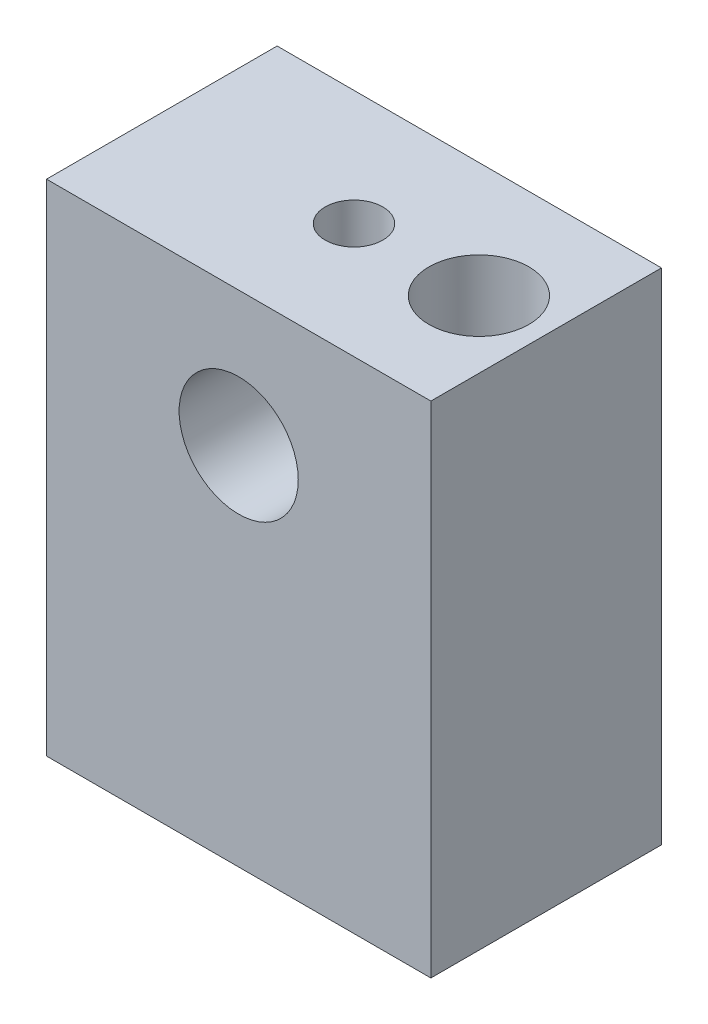
ISO-10303-21;
HEADER;
FILE_DESCRIPTION(('STEP AP214'),'2;1');
FILE_NAME('part.step','',(''),(''),'','','');
FILE_SCHEMA(('AUTOMOTIVE_DESIGN { 1 0 10303 214 1 1 1 1 }'));
ENDSEC;
DATA;
#1=APPLICATION_CONTEXT('core data for automotive mechanical design processes');
#2=APPLICATION_PROTOCOL_DEFINITION('international standard','automotive_design',2000,#1);
#3=PRODUCT_CONTEXT('',#1,'mechanical');
#4=PRODUCT('Part','Part','',(#3));
#5=PRODUCT_RELATED_PRODUCT_CATEGORY('part','',(#4));
#6=PRODUCT_DEFINITION_FORMATION('','',#4);
#7=PRODUCT_DEFINITION_CONTEXT('part definition',#1,'design');
#8=PRODUCT_DEFINITION('design','',#6,#7);
#9=PRODUCT_DEFINITION_SHAPE('','',#8);
#10=(LENGTH_UNIT() NAMED_UNIT(*) SI_UNIT(.MILLI.,.METRE.));
#11=(NAMED_UNIT(*) PLANE_ANGLE_UNIT() SI_UNIT($,.RADIAN.));
#12=(NAMED_UNIT(*) SI_UNIT($,.STERADIAN.) SOLID_ANGLE_UNIT());
#13=UNCERTAINTY_MEASURE_WITH_UNIT(LENGTH_MEASURE(1.E-05),#10,'distance_accuracy_value','');
#14=(GEOMETRIC_REPRESENTATION_CONTEXT(3) GLOBAL_UNCERTAINTY_ASSIGNED_CONTEXT((#13)) GLOBAL_UNIT_ASSIGNED_CONTEXT((#10,
#11,#12)) REPRESENTATION_CONTEXT('',''));
#15=CARTESIAN_POINT('',(0.,0.,0.));
#16=DIRECTION('',(0.,0.,1.));
#17=DIRECTION('',(1.,0.,0.));
#18=AXIS2_PLACEMENT_3D('',#15,#16,#17);
#19=CARTESIAN_POINT('',(-9.99999999999999,26.,12.));
#20=DIRECTION('',(1.,0.,0.));
#21=DIRECTION('',(0.,0.,-1.));
#22=AXIS2_PLACEMENT_3D('',#19,#20,#21);
#23=PLANE('',#22);
#24=DIRECTION('',(0.,-1.,0.));
#25=VECTOR('',#24,1.);
#26=CARTESIAN_POINT('',(-9.99999999999999,26.,0.));
#27=LINE('',#26,#25);
#28=CARTESIAN_POINT('',(-9.99999999999999,26.,0.));
#29=VERTEX_POINT('',#28);
#30=CARTESIAN_POINT('',(-9.99999999999999,0.,0.));
#31=VERTEX_POINT('',#30);
#32=EDGE_CURVE('E104',#29,#31,#27,.T.);
#33=ORIENTED_EDGE('',*,*,#32,.T.);
#34=DIRECTION('',(0.,0.,-1.));
#35=VECTOR('',#34,1.);
#36=CARTESIAN_POINT('',(-9.99999999999999,0.,12.));
#37=LINE('',#36,#35);
#38=CARTESIAN_POINT('',(-9.99999999999999,0.,12.));
#39=VERTEX_POINT('',#38);
#40=EDGE_CURVE('E11',#39,#31,#37,.T.);
#41=ORIENTED_EDGE('',*,*,#40,.F.);
#42=DIRECTION('',(0.,-1.,0.));
#43=VECTOR('',#42,1.);
#44=CARTESIAN_POINT('',(-9.99999999999999,26.,12.));
#45=LINE('',#44,#43);
#46=CARTESIAN_POINT('',(-9.99999999999999,26.,12.));
#47=VERTEX_POINT('',#46);
#48=EDGE_CURVE('E95',#47,#39,#45,.T.);
#49=ORIENTED_EDGE('',*,*,#48,.F.);
#50=DIRECTION('',(0.,0.,-1.));
#51=VECTOR('',#50,1.);
#52=CARTESIAN_POINT('',(-9.99999999999999,26.,12.));
#53=LINE('',#52,#51);
#54=EDGE_CURVE('E101',#47,#29,#53,.T.);
#55=ORIENTED_EDGE('',*,*,#54,.T.);
#56=EDGE_LOOP('',(#33,#41,#49,#55));
#57=FACE_BOUND('',#56,.T.);
#58=ADVANCED_FACE('F39',(#57),#23,.F.);
#59=CARTESIAN_POINT('',(-9.99999999999999,0.,12.));
#60=DIRECTION('',(0.,1.,0.));
#61=DIRECTION('',(0.,0.,1.));
#62=AXIS2_PLACEMENT_3D('',#59,#60,#61);
#63=PLANE('',#62);
#64=CARTESIAN_POINT('',(6.50000000000001,0.,6.00000000000001));
#65=DIRECTION('',(0.,1.,0.));
#66=DIRECTION('',(0.,0.,1.));
#67=AXIS2_PLACEMENT_3D('',#64,#65,#66);
#68=CIRCLE('',#67,2.6);
#69=CARTESIAN_POINT('',(6.50000000000001,0.,8.60000000000001));
#70=VERTEX_POINT('',#69);
#71=EDGE_CURVE('E119',#70,#70,#68,.T.);
#72=ORIENTED_EDGE('',*,*,#71,.T.);
#73=EDGE_LOOP('',(#72));
#74=FACE_BOUND('',#73,.T.);
#75=CARTESIAN_POINT('',(0.,0.,6.00000000000001));
#76=DIRECTION('',(0.,1.,0.));
#77=DIRECTION('',(0.,0.,1.));
#78=AXIS2_PLACEMENT_3D('',#75,#76,#77);
#79=CIRCLE('',#78,1.5);
#80=CARTESIAN_POINT('',(0.,0.,7.50000000000001));
#81=VERTEX_POINT('',#80);
#82=EDGE_CURVE('E209',#81,#81,#79,.T.);
#83=ORIENTED_EDGE('',*,*,#82,.T.);
#84=EDGE_LOOP('',(#83));
#85=FACE_BOUND('',#84,.T.);
#86=DIRECTION('',(1.,0.,0.));
#87=VECTOR('',#86,1.);
#88=CARTESIAN_POINT('',(-9.99999999999999,0.,0.));
#89=LINE('',#88,#87);
#90=CARTESIAN_POINT('',(9.99999999999999,0.,0.));
#91=VERTEX_POINT('',#90);
#92=EDGE_CURVE('E96',#31,#91,#89,.T.);
#93=ORIENTED_EDGE('',*,*,#92,.T.);
#94=DIRECTION('',(0.,0.,-1.));
#95=VECTOR('',#94,1.);
#96=CARTESIAN_POINT('',(9.99999999999999,0.,12.));
#97=LINE('',#96,#95);
#98=CARTESIAN_POINT('',(9.99999999999999,0.,12.));
#99=VERTEX_POINT('',#98);
#100=EDGE_CURVE('E48',#99,#91,#97,.T.);
#101=ORIENTED_EDGE('',*,*,#100,.F.);
#102=DIRECTION('',(1.,0.,0.));
#103=VECTOR('',#102,1.);
#104=CARTESIAN_POINT('',(-9.99999999999999,0.,12.));
#105=LINE('',#104,#103);
#106=EDGE_CURVE('E87',#39,#99,#105,.T.);
#107=ORIENTED_EDGE('',*,*,#106,.F.);
#108=ORIENTED_EDGE('',*,*,#40,.T.);
#109=EDGE_LOOP('',(#93,#101,#107,#108));
#110=FACE_BOUND('',#109,.T.);
#111=ADVANCED_FACE('F92',(#74,#85,#110),#63,.F.);
#112=CARTESIAN_POINT('',(9.99999999999999,0.,12.));
#113=DIRECTION('',(-1.,0.,0.));
#114=DIRECTION('',(0.,0.,1.));
#115=AXIS2_PLACEMENT_3D('',#112,#113,#114);
#116=PLANE('',#115);
#117=DIRECTION('',(0.,1.,0.));
#118=VECTOR('',#117,1.);
#119=CARTESIAN_POINT('',(9.99999999999999,0.,0.));
#120=LINE('',#119,#118);
#121=CARTESIAN_POINT('',(9.99999999999999,26.,0.));
#122=VERTEX_POINT('',#121);
#123=EDGE_CURVE('E74',#91,#122,#120,.T.);
#124=ORIENTED_EDGE('',*,*,#123,.T.);
#125=DIRECTION('',(0.,0.,-1.));
#126=VECTOR('',#125,1.);
#127=CARTESIAN_POINT('',(9.99999999999999,26.,12.));
#128=LINE('',#127,#126);
#129=CARTESIAN_POINT('',(9.99999999999999,26.,12.));
#130=VERTEX_POINT('',#129);
#131=EDGE_CURVE('E100',#130,#122,#128,.T.);
#132=ORIENTED_EDGE('',*,*,#131,.F.);
#133=DIRECTION('',(0.,1.,0.));
#134=VECTOR('',#133,1.);
#135=CARTESIAN_POINT('',(9.99999999999999,0.,12.));
#136=LINE('',#135,#134);
#137=EDGE_CURVE('E89',#99,#130,#136,.T.);
#138=ORIENTED_EDGE('',*,*,#137,.F.);
#139=ORIENTED_EDGE('',*,*,#100,.T.);
#140=EDGE_LOOP('',(#124,#132,#138,#139));
#141=FACE_BOUND('',#140,.T.);
#142=ADVANCED_FACE('F97',(#141),#116,.F.);
#143=CARTESIAN_POINT('',(9.99999999999999,26.,12.));
#144=DIRECTION('',(0.,-1.,0.));
#145=DIRECTION('',(0.,0.,-1.));
#146=AXIS2_PLACEMENT_3D('',#143,#144,#145);
#147=PLANE('',#146);
#148=CARTESIAN_POINT('',(6.50000000000001,26.,6.00000000000001));
#149=DIRECTION('',(0.,-1.,0.));
#150=DIRECTION('',(0.,0.,-1.));
#151=AXIS2_PLACEMENT_3D('',#148,#149,#150);
#152=CIRCLE('',#151,2.6);
#153=CARTESIAN_POINT('',(6.50000000000001,26.,3.4));
#154=VERTEX_POINT('',#153);
#155=EDGE_CURVE('E45',#154,#154,#152,.T.);
#156=ORIENTED_EDGE('',*,*,#155,.T.);
#157=EDGE_LOOP('',(#156));
#158=FACE_BOUND('',#157,.T.);
#159=CARTESIAN_POINT('',(0.,26.,6.00000000000001));
#160=DIRECTION('',(0.,-1.,0.));
#161=DIRECTION('',(0.,0.,-1.));
#162=AXIS2_PLACEMENT_3D('',#159,#160,#161);
#163=CIRCLE('',#162,1.5);
#164=CARTESIAN_POINT('',(0.,26.,4.5));
#165=VERTEX_POINT('',#164);
#166=EDGE_CURVE('E208',#165,#165,#163,.T.);
#167=ORIENTED_EDGE('',*,*,#166,.T.);
#168=EDGE_LOOP('',(#167));
#169=FACE_BOUND('',#168,.T.);
#170=DIRECTION('',(-1.,0.,0.));
#171=VECTOR('',#170,1.);
#172=CARTESIAN_POINT('',(9.99999999999999,26.,0.));
#173=LINE('',#172,#171);
#174=EDGE_CURVE('E78',#122,#29,#173,.T.);
#175=ORIENTED_EDGE('',*,*,#174,.T.);
#176=ORIENTED_EDGE('',*,*,#54,.F.);
#177=DIRECTION('',(-1.,0.,0.));
#178=VECTOR('',#177,1.);
#179=CARTESIAN_POINT('',(9.99999999999999,26.,12.));
#180=LINE('',#179,#178);
#181=EDGE_CURVE('E60',#130,#47,#180,.T.);
#182=ORIENTED_EDGE('',*,*,#181,.F.);
#183=ORIENTED_EDGE('',*,*,#131,.T.);
#184=EDGE_LOOP('',(#175,#176,#182,#183));
#185=FACE_BOUND('',#184,.T.);
#186=ADVANCED_FACE('F167',(#158,#169,#185),#147,.F.);
#187=CARTESIAN_POINT('',(0.,0.,12.));
#188=DIRECTION('',(0.,0.,1.));
#189=DIRECTION('',(1.,0.,0.));
#190=AXIS2_PLACEMENT_3D('',#187,#188,#189);
#191=PLANE('',#190);
#192=CARTESIAN_POINT('',(0.,19.,12.));
#193=DIRECTION('',(0.,0.,1.));
#194=DIRECTION('',(1.,0.,0.));
#195=AXIS2_PLACEMENT_3D('',#192,#193,#194);
#196=CIRCLE('',#195,3.1);
#197=CARTESIAN_POINT('',(3.1,19.,12.));
#198=VERTEX_POINT('',#197);
#199=EDGE_CURVE('E107',#198,#198,#196,.T.);
#200=ORIENTED_EDGE('',*,*,#199,.F.);
#201=EDGE_LOOP('',(#200));
#202=FACE_BOUND('',#201,.T.);
#203=ORIENTED_EDGE('',*,*,#48,.T.);
#204=ORIENTED_EDGE('',*,*,#106,.T.);
#205=ORIENTED_EDGE('',*,*,#137,.T.);
#206=ORIENTED_EDGE('',*,*,#181,.T.);
#207=EDGE_LOOP('',(#203,#204,#205,#206));
#208=FACE_BOUND('',#207,.T.);
#209=ADVANCED_FACE('F86',(#202,#208),#191,.T.);
#210=CARTESIAN_POINT('',(0.,0.,0.));
#211=DIRECTION('',(0.,0.,1.));
#212=DIRECTION('',(1.,0.,0.));
#213=AXIS2_PLACEMENT_3D('',#210,#211,#212);
#214=PLANE('',#213);
#215=CARTESIAN_POINT('',(0.,19.,0.));
#216=DIRECTION('',(0.,0.,1.));
#217=DIRECTION('',(1.,0.,0.));
#218=AXIS2_PLACEMENT_3D('',#215,#216,#217);
#219=CIRCLE('',#218,3.1);
#220=CARTESIAN_POINT('',(3.1,19.,0.));
#221=VERTEX_POINT('',#220);
#222=EDGE_CURVE('E111',#221,#221,#219,.T.);
#223=ORIENTED_EDGE('',*,*,#222,.T.);
#224=EDGE_LOOP('',(#223));
#225=FACE_BOUND('',#224,.T.);
#226=ORIENTED_EDGE('',*,*,#32,.F.);
#227=ORIENTED_EDGE('',*,*,#174,.F.);
#228=ORIENTED_EDGE('',*,*,#123,.F.);
#229=ORIENTED_EDGE('',*,*,#92,.F.);
#230=EDGE_LOOP('',(#226,#227,#228,#229));
#231=FACE_BOUND('',#230,.T.);
#232=ADVANCED_FACE('F156',(#225,#231),#214,.F.);
#233=CARTESIAN_POINT('',(0.,19.,-40.));
#234=DIRECTION('',(0.,0.,1.));
#235=DIRECTION('',(1.,0.,0.));
#236=AXIS2_PLACEMENT_3D('',#233,#234,#235);
#237=CYLINDRICAL_SURFACE('',#236,3.1);
#238=CARTESIAN_POINT('',(0.,15.9,7.50000000000001));
#239=CARTESIAN_POINT('',(-0.0791597718146256,15.9000040235797,7.49999529296469));
#240=CARTESIAN_POINT('',(-0.158422880758096,15.9030650283963,7.4936968395584));
#241=CARTESIAN_POINT('',(-0.314625464678927,15.9150076531734,7.46877262837549));
#242=CARTESIAN_POINT('',(-0.391559818969316,15.9239012454393,7.4501215140343));
#243=CARTESIAN_POINT('',(-0.540603410945919,15.946574157384,7.40138191522431));
#244=CARTESIAN_POINT('',(-0.612729774928935,15.9603348975482,7.37133689401739));
#245=CARTESIAN_POINT('',(-0.750820348738632,15.991464456077,7.30087774159278));
#246=CARTESIAN_POINT('',(-0.816785305340307,16.0088328363635,7.26046486920984));
#247=CARTESIAN_POINT('',(-0.944965336251932,16.046737099973,7.1677555495817));
#248=CARTESIAN_POINT('',(-1.00674424015157,16.0673979428538,7.11490784824097));
#249=CARTESIAN_POINT('',(-1.12095918636624,16.109125592073,7.00001014953007));
#250=CARTESIAN_POINT('',(-1.17338859126746,16.1301926751454,6.93795367145821));
#251=CARTESIAN_POINT('',(-1.27116086028914,16.1720716621745,6.80107224766011));
#252=CARTESIAN_POINT('',(-1.3157302182014,16.19275789251,6.72565192934673));
#253=CARTESIAN_POINT('',(-1.39136353669037,16.2294608832543,6.56726857073154));
#254=CARTESIAN_POINT('',(-1.42243666689193,16.2454808116031,6.48431069808736));
#255=CARTESIAN_POINT('',(-1.46825331672929,16.2696388133128,6.31814710814628));
#256=CARTESIAN_POINT('',(-1.48384017116723,16.278180497007,6.23523541625441));
#257=CARTESIAN_POINT('',(-1.50083891652223,16.2875126728502,6.06756941892268));
#258=CARTESIAN_POINT('',(-1.50226328587823,16.2883099884784,5.9828168015147));
#259=CARTESIAN_POINT('',(-1.49151791991513,16.2823918953948,5.82390250992841));
#260=CARTESIAN_POINT('',(-1.48082916653394,16.2764948218513,5.74960308042116));
#261=CARTESIAN_POINT('',(-1.44871001883635,16.2592760308525,5.60402228930977));
#262=CARTESIAN_POINT('',(-1.4272765472017,16.2479527593595,5.53274179868473));
#263=CARTESIAN_POINT('',(-1.37386819698877,16.2209001371452,5.39320453039567));
#264=CARTESIAN_POINT('',(-1.34165938165877,16.205074289144,5.32505687477442));
#265=CARTESIAN_POINT('',(-1.26778986270146,16.1708013666246,5.19481656105306));
#266=CARTESIAN_POINT('',(-1.2261249505331,16.1523531263516,5.13272661665181));
#267=CARTESIAN_POINT('',(-1.12879722643253,16.1122851054529,5.00866691121353));
#268=CARTESIAN_POINT('',(-1.07206384517149,16.0905476628637,4.94757219414897));
#269=CARTESIAN_POINT('',(-0.949037003731532,16.0481255793912,4.83541374175236));
#270=CARTESIAN_POINT('',(-0.882739536587961,16.027441384715,4.78435423205323));
#271=CARTESIAN_POINT('',(-0.739007342095439,15.9884174669969,4.69177011525146));
#272=CARTESIAN_POINT('',(-0.661227817972473,15.9702083649616,4.65072134482436));
#273=CARTESIAN_POINT('',(-0.498761141995078,15.9392723103676,4.58261538796793));
#274=CARTESIAN_POINT('',(-0.414079197681719,15.9265412695877,4.55554776451727));
#275=CARTESIAN_POINT('',(-0.247406856052806,15.9088433085498,4.51827974111547));
#276=CARTESIAN_POINT('',(-0.16573443615837,15.9033413440186,4.50691327937118));
#277=CARTESIAN_POINT('',(-0.00146762178004019,15.8989136240303,4.49774976490358));
#278=CARTESIAN_POINT('',(0.0811263608154408,15.8999850395814,4.49994687481555));
#279=CARTESIAN_POINT('',(0.23862114055019,15.9082628845899,4.51713594863805));
#280=CARTESIAN_POINT('',(0.313649612850727,15.9150249596294,4.53120138221727));
#281=CARTESIAN_POINT('',(0.460144479402781,15.9334514320392,4.57030888978099));
#282=CARTESIAN_POINT('',(0.531610468327995,15.9451163858236,4.59535220962894));
#283=CARTESIAN_POINT('',(0.671399294149362,15.9727152398898,4.65641696072468));
#284=CARTESIAN_POINT('',(0.739565170236837,15.9887659138433,4.69274308260829));
#285=CARTESIAN_POINT('',(0.86906848671576,16.0235552567536,4.77500539690848));
#286=CARTESIAN_POINT('',(0.930402936001049,16.0422950949939,4.82094577373164));
#287=CARTESIAN_POINT('',(1.05055829421637,16.0826879372071,4.92609104207287));
#288=CARTESIAN_POINT('',(1.10861130896279,16.1044496333999,4.98613342904977));
#289=CARTESIAN_POINT('',(1.21413860407154,16.1470868447511,5.11522683510932));
#290=CARTESIAN_POINT('',(1.26160670421974,16.1679618364619,5.18428308000708));
#291=CARTESIAN_POINT('',(1.34638079859484,16.207235498922,5.33301257113156));
#292=CARTESIAN_POINT('',(1.38320011300135,16.2255004548721,5.41300154862825));
#293=CARTESIAN_POINT('',(1.44246335739849,16.2558379404137,5.57921573627753));
#294=CARTESIAN_POINT('',(1.46492458681638,16.267917918506,5.66543330187508));
#295=CARTESIAN_POINT('',(1.49286246310907,16.2830915409991,5.83300419394676));
#296=CARTESIAN_POINT('',(1.49973158163727,16.2869202091623,5.91405790849331));
#297=CARTESIAN_POINT('',(1.50025262732622,16.2872070736021,6.07620810448124));
#298=CARTESIAN_POINT('',(1.49390918533228,16.2836678522366,6.15730456098242));
#299=CARTESIAN_POINT('',(1.46946506776817,16.2703779711323,6.31008929973768));
#300=CARTESIAN_POINT('',(1.45239610774265,16.2611736992184,6.38199586600108));
#301=CARTESIAN_POINT('',(1.40820330963857,16.2381926125945,6.52186860132616));
#302=CARTESIAN_POINT('',(1.38107637501228,16.2244143898396,6.58983354942251));
#303=CARTESIAN_POINT('',(1.31548342307065,16.1927037242205,6.72492473066532));
#304=CARTESIAN_POINT('',(1.27637853858718,16.1745545230935,6.79168848420078));
#305=CARTESIAN_POINT('',(1.18868027399845,16.1365541042951,6.91813169813996));
#306=CARTESIAN_POINT('',(1.14008216784316,16.1167020416536,6.97780760607931));
#307=CARTESIAN_POINT('',(1.02843624921349,16.0748931828218,7.09525774071261));
#308=CARTESIAN_POINT('',(0.964383277015003,16.0529473707924,7.15208553285705));
#309=CARTESIAN_POINT('',(0.826983509249547,16.0114814653358,7.25436518012468));
#310=CARTESIAN_POINT('',(0.753632067798544,15.9919625942284,7.29981131450964));
#311=CARTESIAN_POINT('',(0.599300668836285,15.9574528876861,7.37779452138669));
#312=CARTESIAN_POINT('',(0.518316820583485,15.9424643782331,7.4103249653733));
#313=CARTESIAN_POINT('',(0.351204897343739,15.9188116286015,7.46089989511798));
#314=CARTESIAN_POINT('',(0.265092589725321,15.9101289874927,7.47898654430788));
#315=CARTESIAN_POINT('',(0.148489152154459,15.9034154248188,7.49293017778457));
#316=CARTESIAN_POINT('',(0.118872749779969,15.9021375733592,7.49557806913414));
#317=CARTESIAN_POINT('',(0.0595091028736365,15.9004290938297,7.49911388741649));
#318=CARTESIAN_POINT('',(0.0297618550425709,15.8999984872469,7.50000176971333));
#319=CARTESIAN_POINT('',(0.,15.9,7.50000000000001));
#320=B_SPLINE_CURVE_WITH_KNOTS('',3,(#238,#239,#240,#241,#242,#243,#244,#245,#246,#247,#248,
#249,#250,#251,#252,#253,#254,#255,#256,#257,#258,#259,#260,#261,#262,#263,#264,#265,#266,#267,
#268,#269,#270,#271,#272,#273,#274,#275,#276,#277,#278,#279,#280,#281,#282,#283,#284,#285,#286,
#287,#288,#289,#290,#291,#292,#293,#294,#295,#296,#297,#298,#299,#300,#301,#302,#303,#304,#305,
#306,#307,#308,#309,#310,#311,#312,#313,#314,#315,#316,#317,#318,#319),.UNSPECIFIED.,.T.,.F.,(4,
2,2,2,2,2,2,2,2,2,2,2,2,2,2,2,2,2,2,2,2,2,2,2,2,2,2,2,2,2,2,2,2,2,2,2,2,2,2,2,4),(0.,
0.237358149391482,0.475205045204223,0.712153629381457,0.949073457545615,1.19966743221416,
1.45043860686556,1.71911904496211,1.98761664919518,2.24052562014626,2.49321173549779,
2.71804786039364,2.94294841582363,3.17308816404914,3.40333054008846,3.66068413428496,
3.91814586404605,4.18614615771728,4.45394609714843,4.70053706585277,4.94702191641386,
5.17587433638078,5.40475273518385,5.64044645973029,5.87624297925293,6.13403038031834,
6.39196790389034,6.66030131434513,6.92831080921333,7.17124517031378,7.41409440013794,
7.63655663166079,7.85908740955729,8.09655437634792,8.33413986498566,8.59809861420733,
8.86218977137577,9.12641628901264,9.38986864430433,9.47910639124578,9.56834640133455),.UNSPECIFIED.);
#321=CARTESIAN_POINT('',(0.,15.9,7.50000000000001));
#322=VERTEX_POINT('',#321);
#323=EDGE_CURVE('E124',#322,#322,#320,.T.);
#324=ORIENTED_EDGE('',*,*,#323,.T.);
#325=EDGE_LOOP('',(#324));
#326=FACE_BOUND('',#325,.T.);
#327=CARTESIAN_POINT('',(0.,22.1,7.50000000000001));
#328=CARTESIAN_POINT('',(0.0791597718146255,22.0999959764204,7.49999529296469));
#329=CARTESIAN_POINT('',(0.158422880758095,22.0969349716037,7.4936968395584));
#330=CARTESIAN_POINT('',(0.314625464678926,22.0849923468267,7.46877262837549));
#331=CARTESIAN_POINT('',(0.391559818969317,22.0760987545607,7.4501215140343));
#332=CARTESIAN_POINT('',(0.540603410945918,22.053425842616,7.40138191522431));
#333=CARTESIAN_POINT('',(0.612729774928929,22.0396651024518,7.3713368940174));
#334=CARTESIAN_POINT('',(0.750820348738627,22.008535543923,7.30087774159278));
#335=CARTESIAN_POINT('',(0.816785305340308,21.9911671636365,7.26046486920984));
#336=CARTESIAN_POINT('',(0.944965336251931,21.9532629000271,7.1677555495817));
#337=CARTESIAN_POINT('',(1.00674424015156,21.9326020571462,7.11490784824098));
#338=CARTESIAN_POINT('',(1.12095918636623,21.890874407927,7.00001014953008));
#339=CARTESIAN_POINT('',(1.17338859126746,21.8698073248547,6.93795367145821));
#340=CARTESIAN_POINT('',(1.27116086028914,21.8279283378255,6.80107224766011));
#341=CARTESIAN_POINT('',(1.31573021820139,21.80724210749,6.72565192934674));
#342=CARTESIAN_POINT('',(1.39136353669036,21.7705391167457,6.56726857073155));
#343=CARTESIAN_POINT('',(1.42243666689193,21.7545191883969,6.48431069808736));
#344=CARTESIAN_POINT('',(1.46825331672929,21.7303611866873,6.31814710814628));
#345=CARTESIAN_POINT('',(1.48384017116723,21.721819502993,6.23523541625442));
#346=CARTESIAN_POINT('',(1.50083891652223,21.7124873271497,6.06756941892269));
#347=CARTESIAN_POINT('',(1.50226328587823,21.7116900115216,5.9828168015147));
#348=CARTESIAN_POINT('',(1.49151791991513,21.7176081046053,5.82390250992841));
#349=CARTESIAN_POINT('',(1.48082916653394,21.7235051781487,5.74960308042115));
#350=CARTESIAN_POINT('',(1.44871001883635,21.7407239691475,5.60402228930976));
#351=CARTESIAN_POINT('',(1.4272765472017,21.7520472406405,5.53274179868473));
#352=CARTESIAN_POINT('',(1.37386819698877,21.7790998628548,5.39320453039567));
#353=CARTESIAN_POINT('',(1.34165938165877,21.7949257108559,5.32505687477442));
#354=CARTESIAN_POINT('',(1.26778986270146,21.8291986333754,5.19481656105305));
#355=CARTESIAN_POINT('',(1.2261249505331,21.8476468736483,5.1327266166518));
#356=CARTESIAN_POINT('',(1.12879722643253,21.887714894547,5.00866691121353));
#357=CARTESIAN_POINT('',(1.0720638451715,21.9094523371362,4.94757219414897));
#358=CARTESIAN_POINT('',(0.949037003731537,21.9518744206088,4.83541374175237));
#359=CARTESIAN_POINT('',(0.882739536587965,21.972558615285,4.78435423205323));
#360=CARTESIAN_POINT('',(0.739007342095439,22.0115825330031,4.69177011525146));
#361=CARTESIAN_POINT('',(0.661227817972468,22.0297916350384,4.65072134482435));
#362=CARTESIAN_POINT('',(0.498761141995073,22.0607276896324,4.58261538796793));
#363=CARTESIAN_POINT('',(0.414079197681718,22.0734587304123,4.55554776451727));
#364=CARTESIAN_POINT('',(0.247406856052808,22.0911566914502,4.51827974111548));
#365=CARTESIAN_POINT('',(0.165734436158372,22.0966586559815,4.50691327937119));
#366=CARTESIAN_POINT('',(0.00146762178004311,22.1010863759697,4.49774976490358));
#367=CARTESIAN_POINT('',(-0.0811263608154367,22.1000149604185,4.49994687481555));
#368=CARTESIAN_POINT('',(-0.238621140550194,22.09173711541,4.51713594863805));
#369=CARTESIAN_POINT('',(-0.313649612850739,22.0849750403706,4.53120138221727));
#370=CARTESIAN_POINT('',(-0.460144479402798,22.0665485679608,4.57030888978099));
#371=CARTESIAN_POINT('',(-0.531610468328009,22.0548836141764,4.59535220962894));
#372=CARTESIAN_POINT('',(-0.671399294149374,22.0272847601103,4.65641696072468));
#373=CARTESIAN_POINT('',(-0.739565170236852,22.0112340861568,4.6927430826083));
#374=CARTESIAN_POINT('',(-0.869068486715769,21.9764447432464,4.77500539690849));
#375=CARTESIAN_POINT('',(-0.93040293600105,21.9577049050061,4.82094577373164));
#376=CARTESIAN_POINT('',(-1.05055829421637,21.917312062793,4.92609104207287));
#377=CARTESIAN_POINT('',(-1.10861130896279,21.8955503666002,4.98613342904978));
#378=CARTESIAN_POINT('',(-1.21413860407155,21.852913155249,5.11522683510933));
#379=CARTESIAN_POINT('',(-1.26160670421974,21.8320381635382,5.18428308000708));
#380=CARTESIAN_POINT('',(-1.34638079859484,21.792764501078,5.33301257113156));
#381=CARTESIAN_POINT('',(-1.38320011300136,21.774499545128,5.41300154862826));
#382=CARTESIAN_POINT('',(-1.44246335739849,21.7441620595864,5.57921573627754));
#383=CARTESIAN_POINT('',(-1.46492458681638,21.732082081494,5.66543330187508));
#384=CARTESIAN_POINT('',(-1.49286246310907,21.7169084590009,5.83300419394676));
#385=CARTESIAN_POINT('',(-1.49973158163727,21.7130797908378,5.91405790849331));
#386=CARTESIAN_POINT('',(-1.50025262732622,21.712792926398,6.07620810448124));
#387=CARTESIAN_POINT('',(-1.49390918533228,21.7163321477634,6.15730456098242));
#388=CARTESIAN_POINT('',(-1.46946506776817,21.7296220288677,6.31008929973768));
#389=CARTESIAN_POINT('',(-1.45239610774266,21.7388263007817,6.38199586600107));
#390=CARTESIAN_POINT('',(-1.40820330963857,21.7618073874056,6.52186860132614));
#391=CARTESIAN_POINT('',(-1.38107637501228,21.7755856101605,6.58983354942251));
#392=CARTESIAN_POINT('',(-1.31548342307065,21.8072962757795,6.72492473066532));
#393=CARTESIAN_POINT('',(-1.27637853858718,21.8254454769066,6.79168848420077));
#394=CARTESIAN_POINT('',(-1.18868027399846,21.863445895705,6.91813169813994));
#395=CARTESIAN_POINT('',(-1.14008216784316,21.8832979583465,6.97780760607931));
#396=CARTESIAN_POINT('',(-1.02843624921349,21.9251068171783,7.09525774071261));
#397=CARTESIAN_POINT('',(-0.96438327701501,21.9470526292076,7.15208553285705));
#398=CARTESIAN_POINT('',(-0.826983509249555,21.9885185346643,7.25436518012467));
#399=CARTESIAN_POINT('',(-0.753632067798545,22.0080374057716,7.29981131450963));
#400=CARTESIAN_POINT('',(-0.599300668836283,22.0425471123139,7.3777945213867));
#401=CARTESIAN_POINT('',(-0.518316820583487,22.0575356217669,7.4103249653733));
#402=CARTESIAN_POINT('',(-0.351204897343741,22.0811883713986,7.46089989511798));
#403=CARTESIAN_POINT('',(-0.265092589725321,22.0898710125073,7.47898654430788));
#404=CARTESIAN_POINT('',(-0.148489152154459,22.0965845751812,7.49293017778457));
#405=CARTESIAN_POINT('',(-0.118872749779969,22.0978624266408,7.49557806913414));
#406=CARTESIAN_POINT('',(-0.0595091028736365,22.0995709061703,7.49911388741649));
#407=CARTESIAN_POINT('',(-0.0297618550425708,22.1000015127532,7.50000176971333));
#408=CARTESIAN_POINT('',(0.,22.1,7.50000000000001));
#409=B_SPLINE_CURVE_WITH_KNOTS('',3,(#327,#328,#329,#330,#331,#332,#333,#334,#335,#336,#337,
#338,#339,#340,#341,#342,#343,#344,#345,#346,#347,#348,#349,#350,#351,#352,#353,#354,#355,#356,
#357,#358,#359,#360,#361,#362,#363,#364,#365,#366,#367,#368,#369,#370,#371,#372,#373,#374,#375,
#376,#377,#378,#379,#380,#381,#382,#383,#384,#385,#386,#387,#388,#389,#390,#391,#392,#393,#394,
#395,#396,#397,#398,#399,#400,#401,#402,#403,#404,#405,#406,#407,#408),.UNSPECIFIED.,.T.,.F.,(4,
2,2,2,2,2,2,2,2,2,2,2,2,2,2,2,2,2,2,2,2,2,2,2,2,2,2,2,2,2,2,2,2,2,2,2,2,2,2,2,4),(0.,
0.237358149391482,0.475205045204223,0.712153629381455,0.949073457545613,1.19966743221415,
1.45043860686556,1.71911904496211,1.98761664919518,2.24052562014627,2.4932117354978,
2.71804786039365,2.94294841582364,3.17308816404914,3.40333054008845,3.66068413428496,
3.91814586404607,4.1861461577173,4.45394609714844,4.70053706585278,4.94702191641387,
5.1758743363808,5.40475273518387,5.6404464597303,5.87624297925294,6.13403038031835,
6.39196790389035,6.66030131434513,6.92831080921333,7.17124517031378,7.41409440013794,
7.63655663166078,7.85908740955728,8.09655437634791,8.33413986498565,8.59809861420732,
8.86218977137576,9.12641628901263,9.38986864430433,9.47910639124578,9.56834640133455),.UNSPECIFIED.);
#410=CARTESIAN_POINT('',(0.,22.1,7.50000000000001));
#411=VERTEX_POINT('',#410);
#412=EDGE_CURVE('E120',#411,#411,#409,.T.);
#413=ORIENTED_EDGE('',*,*,#412,.T.);
#414=EDGE_LOOP('',(#413));
#415=FACE_BOUND('',#414,.T.);
#416=ORIENTED_EDGE('',*,*,#199,.T.);
#417=EDGE_LOOP('',(#416));
#418=FACE_BOUND('',#417,.T.);
#419=ORIENTED_EDGE('',*,*,#222,.F.);
#420=EDGE_LOOP('',(#419));
#421=FACE_BOUND('',#420,.T.);
#422=ADVANCED_FACE('F129',(#326,#415,#418,#421),#237,.F.);
#423=CARTESIAN_POINT('',(0.,-40.,6.00000000000001));
#424=DIRECTION('',(0.,1.,0.));
#425=DIRECTION('',(0.,0.,1.));
#426=AXIS2_PLACEMENT_3D('',#423,#424,#425);
#427=CYLINDRICAL_SURFACE('',#426,1.5);
#428=ORIENTED_EDGE('',*,*,#412,.F.);
#429=EDGE_LOOP('',(#428));
#430=FACE_BOUND('',#429,.T.);
#431=ORIENTED_EDGE('',*,*,#166,.F.);
#432=EDGE_LOOP('',(#431));
#433=FACE_BOUND('',#432,.T.);
#434=ADVANCED_FACE('F140',(#430,#433),#427,.F.);
#435=ORIENTED_EDGE('',*,*,#323,.F.);
#436=EDGE_LOOP('',(#435));
#437=FACE_BOUND('',#436,.T.);
#438=ORIENTED_EDGE('',*,*,#82,.F.);
#439=EDGE_LOOP('',(#438));
#440=FACE_BOUND('',#439,.T.);
#441=ADVANCED_FACE('F134',(#437,#440),#427,.F.);
#442=CARTESIAN_POINT('',(6.50000000000001,-40.,6.00000000000001));
#443=DIRECTION('',(0.,1.,0.));
#444=DIRECTION('',(0.,0.,1.));
#445=AXIS2_PLACEMENT_3D('',#442,#443,#444);
#446=CYLINDRICAL_SURFACE('',#445,2.6);
#447=ORIENTED_EDGE('',*,*,#155,.F.);
#448=EDGE_LOOP('',(#447));
#449=FACE_BOUND('',#448,.T.);
#450=ORIENTED_EDGE('',*,*,#71,.F.);
#451=EDGE_LOOP('',(#450));
#452=FACE_BOUND('',#451,.T.);
#453=ADVANCED_FACE('F136',(#449,#452),#446,.F.);
#454=CLOSED_SHELL('',(#58,#111,#142,#186,#209,#232,#422,#434,#441,#453));
#455=MANIFOLD_SOLID_BREP('B2',#454);
#456=ADVANCED_BREP_SHAPE_REPRESENTATION('',(#18,#455),#14);
#457=SHAPE_DEFINITION_REPRESENTATION(#9,#456);
ENDSEC;
END-ISO-10303-21;
